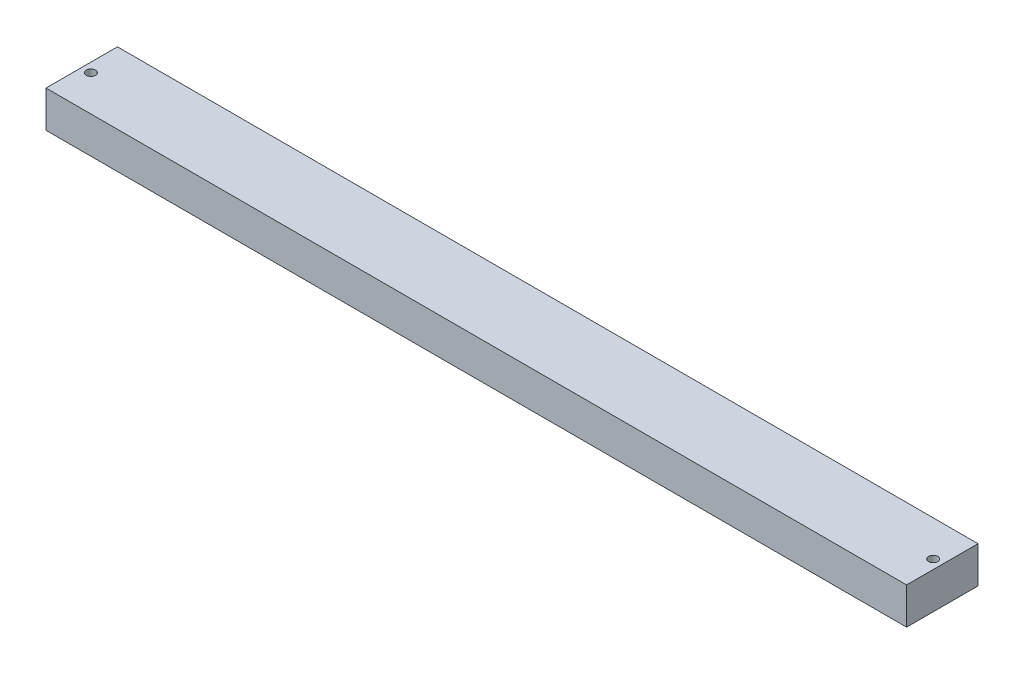
ISO-10303-21;
HEADER;
FILE_DESCRIPTION(('STEP AP214'),'2;1');
FILE_NAME('part.step','',(''),(''),'','','');
FILE_SCHEMA(('AUTOMOTIVE_DESIGN { 1 0 10303 214 1 1 1 1 }'));
ENDSEC;
DATA;
#1=APPLICATION_CONTEXT('core data for automotive mechanical design processes');
#2=APPLICATION_PROTOCOL_DEFINITION('international standard','automotive_design',2000,#1);
#3=PRODUCT_CONTEXT('',#1,'mechanical');
#4=PRODUCT('Part','Part','',(#3));
#5=PRODUCT_RELATED_PRODUCT_CATEGORY('part','',(#4));
#6=PRODUCT_DEFINITION_FORMATION('','',#4);
#7=PRODUCT_DEFINITION_CONTEXT('part definition',#1,'design');
#8=PRODUCT_DEFINITION('design','',#6,#7);
#9=PRODUCT_DEFINITION_SHAPE('','',#8);
#10=(LENGTH_UNIT() NAMED_UNIT(*) SI_UNIT(.MILLI.,.METRE.));
#11=(NAMED_UNIT(*) PLANE_ANGLE_UNIT() SI_UNIT($,.RADIAN.));
#12=(NAMED_UNIT(*) SI_UNIT($,.STERADIAN.) SOLID_ANGLE_UNIT());
#13=UNCERTAINTY_MEASURE_WITH_UNIT(LENGTH_MEASURE(1.E-05),#10,'distance_accuracy_value','');
#14=(GEOMETRIC_REPRESENTATION_CONTEXT(3) GLOBAL_UNCERTAINTY_ASSIGNED_CONTEXT((#13)) GLOBAL_UNIT_ASSIGNED_CONTEXT((#10,
#11,#12)) REPRESENTATION_CONTEXT('',''));
#15=CARTESIAN_POINT('',(0.,0.,0.));
#16=DIRECTION('',(0.,0.,1.));
#17=DIRECTION('',(1.,0.,0.));
#18=AXIS2_PLACEMENT_3D('',#15,#16,#17);
#19=CARTESIAN_POINT('',(175.,-18.,0.));
#20=DIRECTION('',(0.,1.,0.));
#21=DIRECTION('',(-1.,0.,0.));
#22=AXIS2_PLACEMENT_3D('',#19,#20,#21);
#23=CYLINDRICAL_SURFACE('',#22,10.);
#24=CARTESIAN_POINT('',(175.,-9.99999999999998,0.));
#25=DIRECTION('',(0.,1.,0.));
#26=DIRECTION('',(-1.,0.,0.));
#27=AXIS2_PLACEMENT_3D('',#24,#25,#26);
#28=CIRCLE('',#27,10.);
#29=CARTESIAN_POINT('',(165.,-9.99999999999998,0.));
#30=VERTEX_POINT('',#29);
#31=EDGE_CURVE('E141',#30,#30,#28,.T.);
#32=ORIENTED_EDGE('',*,*,#31,.F.);
#33=EDGE_LOOP('',(#32));
#34=FACE_BOUND('',#33,.T.);
#35=CARTESIAN_POINT('',(175.,5.20000000000002,0.));
#36=DIRECTION('',(0.,1.,0.));
#37=DIRECTION('',(-1.,0.,0.));
#38=AXIS2_PLACEMENT_3D('',#35,#36,#37);
#39=CIRCLE('',#38,10.);
#40=CARTESIAN_POINT('',(165.,5.20000000000002,0.));
#41=VERTEX_POINT('',#40);
#42=EDGE_CURVE('E13',#41,#41,#39,.F.);
#43=ORIENTED_EDGE('',*,*,#42,.F.);
#44=EDGE_LOOP('',(#43));
#45=FACE_BOUND('',#44,.T.);
#46=ADVANCED_FACE('F48',(#34,#45),#23,.F.);
#47=CARTESIAN_POINT('',(125.,-18.,0.));
#48=DIRECTION('',(0.,1.,0.));
#49=DIRECTION('',(-1.,0.,0.));
#50=AXIS2_PLACEMENT_3D('',#47,#48,#49);
#51=CYLINDRICAL_SURFACE('',#50,10.);
#52=CARTESIAN_POINT('',(125.,-9.99999999999999,0.));
#53=DIRECTION('',(0.,1.,0.));
#54=DIRECTION('',(-1.,0.,0.));
#55=AXIS2_PLACEMENT_3D('',#52,#53,#54);
#56=CIRCLE('',#55,10.);
#57=CARTESIAN_POINT('',(115.,-9.99999999999999,0.));
#58=VERTEX_POINT('',#57);
#59=EDGE_CURVE('E138',#58,#58,#56,.T.);
#60=ORIENTED_EDGE('',*,*,#59,.F.);
#61=EDGE_LOOP('',(#60));
#62=FACE_BOUND('',#61,.T.);
#63=CARTESIAN_POINT('',(125.,5.20000000000002,0.));
#64=DIRECTION('',(0.,1.,0.));
#65=DIRECTION('',(-1.,0.,0.));
#66=AXIS2_PLACEMENT_3D('',#63,#64,#65);
#67=CIRCLE('',#66,10.);
#68=CARTESIAN_POINT('',(115.,5.20000000000002,0.));
#69=VERTEX_POINT('',#68);
#70=EDGE_CURVE('E56',#69,#69,#67,.F.);
#71=ORIENTED_EDGE('',*,*,#70,.F.);
#72=EDGE_LOOP('',(#71));
#73=FACE_BOUND('',#72,.T.);
#74=ADVANCED_FACE('F166',(#62,#73),#51,.F.);
#75=CARTESIAN_POINT('',(75.,-18.,0.));
#76=DIRECTION('',(0.,1.,0.));
#77=DIRECTION('',(-1.,0.,0.));
#78=AXIS2_PLACEMENT_3D('',#75,#76,#77);
#79=CYLINDRICAL_SURFACE('',#78,10.);
#80=CARTESIAN_POINT('',(75.,-9.99999999999999,0.));
#81=DIRECTION('',(0.,1.,0.));
#82=DIRECTION('',(-1.,0.,0.));
#83=AXIS2_PLACEMENT_3D('',#80,#81,#82);
#84=CIRCLE('',#83,10.);
#85=CARTESIAN_POINT('',(64.9999999999999,-9.99999999999999,0.));
#86=VERTEX_POINT('',#85);
#87=EDGE_CURVE('E135',#86,#86,#84,.T.);
#88=ORIENTED_EDGE('',*,*,#87,.F.);
#89=EDGE_LOOP('',(#88));
#90=FACE_BOUND('',#89,.T.);
#91=CARTESIAN_POINT('',(75.,5.20000000000001,0.));
#92=DIRECTION('',(0.,1.,0.));
#93=DIRECTION('',(-1.,0.,0.));
#94=AXIS2_PLACEMENT_3D('',#91,#92,#93);
#95=CIRCLE('',#94,10.);
#96=CARTESIAN_POINT('',(64.9999999999999,5.20000000000001,0.));
#97=VERTEX_POINT('',#96);
#98=EDGE_CURVE('E159',#97,#97,#95,.F.);
#99=ORIENTED_EDGE('',*,*,#98,.F.);
#100=EDGE_LOOP('',(#99));
#101=FACE_BOUND('',#100,.T.);
#102=ADVANCED_FACE('F168',(#90,#101),#79,.F.);
#103=CARTESIAN_POINT('',(25.,-18.,0.));
#104=DIRECTION('',(0.,1.,0.));
#105=DIRECTION('',(-1.,0.,0.));
#106=AXIS2_PLACEMENT_3D('',#103,#104,#105);
#107=CYLINDRICAL_SURFACE('',#106,10.);
#108=CARTESIAN_POINT('',(25.,-10.,0.));
#109=DIRECTION('',(0.,1.,0.));
#110=DIRECTION('',(-1.,0.,0.));
#111=AXIS2_PLACEMENT_3D('',#108,#109,#110);
#112=CIRCLE('',#111,10.);
#113=CARTESIAN_POINT('',(15.,-10.,0.));
#114=VERTEX_POINT('',#113);
#115=EDGE_CURVE('E132',#114,#114,#112,.T.);
#116=ORIENTED_EDGE('',*,*,#115,.F.);
#117=EDGE_LOOP('',(#116));
#118=FACE_BOUND('',#117,.T.);
#119=CARTESIAN_POINT('',(25.,5.20000000000001,0.));
#120=DIRECTION('',(0.,1.,0.));
#121=DIRECTION('',(-1.,0.,0.));
#122=AXIS2_PLACEMENT_3D('',#119,#120,#121);
#123=CIRCLE('',#122,10.);
#124=CARTESIAN_POINT('',(15.,5.20000000000001,0.));
#125=VERTEX_POINT('',#124);
#126=EDGE_CURVE('E156',#125,#125,#123,.F.);
#127=ORIENTED_EDGE('',*,*,#126,.F.);
#128=EDGE_LOOP('',(#127));
#129=FACE_BOUND('',#128,.T.);
#130=ADVANCED_FACE('F174',(#118,#129),#107,.F.);
#131=CARTESIAN_POINT('',(-25.,-18.,0.));
#132=DIRECTION('',(0.,1.,0.));
#133=DIRECTION('',(-1.,0.,0.));
#134=AXIS2_PLACEMENT_3D('',#131,#132,#133);
#135=CYLINDRICAL_SURFACE('',#134,10.);
#136=CARTESIAN_POINT('',(-25.,-10.,0.));
#137=DIRECTION('',(0.,1.,0.));
#138=DIRECTION('',(-1.,0.,0.));
#139=AXIS2_PLACEMENT_3D('',#136,#137,#138);
#140=CIRCLE('',#139,10.);
#141=CARTESIAN_POINT('',(-35.,-10.,0.));
#142=VERTEX_POINT('',#141);
#143=EDGE_CURVE('E129',#142,#142,#140,.T.);
#144=ORIENTED_EDGE('',*,*,#143,.F.);
#145=EDGE_LOOP('',(#144));
#146=FACE_BOUND('',#145,.T.);
#147=CARTESIAN_POINT('',(-25.,5.2,0.));
#148=DIRECTION('',(0.,1.,0.));
#149=DIRECTION('',(-1.,0.,0.));
#150=AXIS2_PLACEMENT_3D('',#147,#148,#149);
#151=CIRCLE('',#150,10.);
#152=CARTESIAN_POINT('',(-35.,5.2,0.));
#153=VERTEX_POINT('',#152);
#154=EDGE_CURVE('E153',#153,#153,#151,.F.);
#155=ORIENTED_EDGE('',*,*,#154,.F.);
#156=EDGE_LOOP('',(#155));
#157=FACE_BOUND('',#156,.T.);
#158=ADVANCED_FACE('F182',(#146,#157),#135,.F.);
#159=CARTESIAN_POINT('',(-75.0000000000001,-18.,0.));
#160=DIRECTION('',(0.,1.,0.));
#161=DIRECTION('',(-1.,0.,0.));
#162=AXIS2_PLACEMENT_3D('',#159,#160,#161);
#163=CYLINDRICAL_SURFACE('',#162,10.);
#164=CARTESIAN_POINT('',(-75.0000000000001,-10.,0.));
#165=DIRECTION('',(0.,1.,0.));
#166=DIRECTION('',(-1.,0.,0.));
#167=AXIS2_PLACEMENT_3D('',#164,#165,#166);
#168=CIRCLE('',#167,10.);
#169=CARTESIAN_POINT('',(-85.0000000000001,-10.,0.));
#170=VERTEX_POINT('',#169);
#171=EDGE_CURVE('E126',#170,#170,#168,.T.);
#172=ORIENTED_EDGE('',*,*,#171,.F.);
#173=EDGE_LOOP('',(#172));
#174=FACE_BOUND('',#173,.T.);
#175=CARTESIAN_POINT('',(-75.0000000000001,5.19999999999999,0.));
#176=DIRECTION('',(0.,1.,0.));
#177=DIRECTION('',(-1.,0.,0.));
#178=AXIS2_PLACEMENT_3D('',#175,#176,#177);
#179=CIRCLE('',#178,10.);
#180=CARTESIAN_POINT('',(-85.0000000000001,5.19999999999999,0.));
#181=VERTEX_POINT('',#180);
#182=EDGE_CURVE('E150',#181,#181,#179,.F.);
#183=ORIENTED_EDGE('',*,*,#182,.F.);
#184=EDGE_LOOP('',(#183));
#185=FACE_BOUND('',#184,.T.);
#186=ADVANCED_FACE('F186',(#174,#185),#163,.F.);
#187=CARTESIAN_POINT('',(-125.,-18.,0.));
#188=DIRECTION('',(0.,1.,0.));
#189=DIRECTION('',(-1.,0.,0.));
#190=AXIS2_PLACEMENT_3D('',#187,#188,#189);
#191=CYLINDRICAL_SURFACE('',#190,10.);
#192=CARTESIAN_POINT('',(-125.,-10.,0.));
#193=DIRECTION('',(0.,1.,0.));
#194=DIRECTION('',(-1.,0.,0.));
#195=AXIS2_PLACEMENT_3D('',#192,#193,#194);
#196=CIRCLE('',#195,10.);
#197=CARTESIAN_POINT('',(-135.,-10.,0.));
#198=VERTEX_POINT('',#197);
#199=EDGE_CURVE('E327',#198,#198,#196,.T.);
#200=ORIENTED_EDGE('',*,*,#199,.F.);
#201=EDGE_LOOP('',(#200));
#202=FACE_BOUND('',#201,.T.);
#203=CARTESIAN_POINT('',(-125.,5.19999999999999,0.));
#204=DIRECTION('',(0.,1.,0.));
#205=DIRECTION('',(-1.,0.,0.));
#206=AXIS2_PLACEMENT_3D('',#203,#204,#205);
#207=CIRCLE('',#206,10.);
#208=CARTESIAN_POINT('',(-135.,5.19999999999999,0.));
#209=VERTEX_POINT('',#208);
#210=EDGE_CURVE('E147',#209,#209,#207,.F.);
#211=ORIENTED_EDGE('',*,*,#210,.F.);
#212=EDGE_LOOP('',(#211));
#213=FACE_BOUND('',#212,.T.);
#214=ADVANCED_FACE('F190',(#202,#213),#191,.F.);
#215=CARTESIAN_POINT('',(-175.,-18.,0.));
#216=DIRECTION('',(0.,1.,0.));
#217=DIRECTION('',(-1.,0.,0.));
#218=AXIS2_PLACEMENT_3D('',#215,#216,#217);
#219=CYLINDRICAL_SURFACE('',#218,10.);
#220=CARTESIAN_POINT('',(-175.,-10.,0.));
#221=DIRECTION('',(0.,1.,0.));
#222=DIRECTION('',(-1.,0.,0.));
#223=AXIS2_PLACEMENT_3D('',#220,#221,#222);
#224=CIRCLE('',#223,10.);
#225=CARTESIAN_POINT('',(-185.,-10.,0.));
#226=VERTEX_POINT('',#225);
#227=EDGE_CURVE('E119',#226,#226,#224,.T.);
#228=ORIENTED_EDGE('',*,*,#227,.F.);
#229=EDGE_LOOP('',(#228));
#230=FACE_BOUND('',#229,.T.);
#231=CARTESIAN_POINT('',(-175.,5.19999999999998,0.));
#232=DIRECTION('',(0.,1.,0.));
#233=DIRECTION('',(-1.,0.,0.));
#234=AXIS2_PLACEMENT_3D('',#231,#232,#233);
#235=CIRCLE('',#234,10.);
#236=CARTESIAN_POINT('',(-185.,5.19999999999998,0.));
#237=VERTEX_POINT('',#236);
#238=EDGE_CURVE('E144',#237,#237,#235,.F.);
#239=ORIENTED_EDGE('',*,*,#238,.F.);
#240=EDGE_LOOP('',(#239));
#241=FACE_BOUND('',#240,.T.);
#242=ADVANCED_FACE('F195',(#230,#241),#219,.F.);
#243=CARTESIAN_POINT('',(-235.,-10.,19.5));
#244=DIRECTION('',(1.,0.,0.));
#245=DIRECTION('',(0.,0.,-1.));
#246=AXIS2_PLACEMENT_3D('',#243,#244,#245);
#247=PLANE('',#246);
#248=CARTESIAN_POINT('',(-235.,-5.99999999993247,-12.5));
#249=DIRECTION('',(-1.,0.,0.));
#250=DIRECTION('',(0.,0.,1.));
#251=AXIS2_PLACEMENT_3D('',#248,#249,#250);
#252=CIRCLE('',#251,1.5);
#253=CARTESIAN_POINT('',(-235.,-5.99999999993247,-11.));
#254=VERTEX_POINT('',#253);
#255=EDGE_CURVE('E305',#254,#254,#252,.T.);
#256=ORIENTED_EDGE('',*,*,#255,.F.);
#257=EDGE_LOOP('',(#256));
#258=FACE_BOUND('',#257,.T.);
#259=CARTESIAN_POINT('',(-235.,6.00000000006753,9.5));
#260=DIRECTION('',(-1.,0.,0.));
#261=DIRECTION('',(0.,0.,1.));
#262=AXIS2_PLACEMENT_3D('',#259,#260,#261);
#263=CIRCLE('',#262,1.5);
#264=CARTESIAN_POINT('',(-235.,6.00000000006753,11.));
#265=VERTEX_POINT('',#264);
#266=EDGE_CURVE('E292',#265,#265,#263,.T.);
#267=ORIENTED_EDGE('',*,*,#266,.F.);
#268=EDGE_LOOP('',(#267));
#269=FACE_BOUND('',#268,.T.);
#270=CARTESIAN_POINT('',(-235.,-5.99999999993247,9.5));
#271=DIRECTION('',(-1.,0.,0.));
#272=DIRECTION('',(0.,0.,1.));
#273=AXIS2_PLACEMENT_3D('',#270,#271,#272);
#274=CIRCLE('',#273,1.5);
#275=CARTESIAN_POINT('',(-235.,-5.99999999993247,11.));
#276=VERTEX_POINT('',#275);
#277=EDGE_CURVE('E293',#276,#276,#274,.T.);
#278=ORIENTED_EDGE('',*,*,#277,.F.);
#279=EDGE_LOOP('',(#278));
#280=FACE_BOUND('',#279,.T.);
#281=CARTESIAN_POINT('',(-235.,6.00000000006753,-12.5));
#282=DIRECTION('',(-1.,0.,0.));
#283=DIRECTION('',(0.,0.,1.));
#284=AXIS2_PLACEMENT_3D('',#281,#282,#283);
#285=CIRCLE('',#284,1.5);
#286=CARTESIAN_POINT('',(-235.,6.00000000006753,-11.));
#287=VERTEX_POINT('',#286);
#288=EDGE_CURVE('E304',#287,#287,#285,.T.);
#289=ORIENTED_EDGE('',*,*,#288,.F.);
#290=EDGE_LOOP('',(#289));
#291=FACE_BOUND('',#290,.T.);
#292=DIRECTION('',(0.,-1.,0.));
#293=VECTOR('',#292,1.);
#294=CARTESIAN_POINT('',(-235.,-10.,-19.5));
#295=LINE('',#294,#293);
#296=CARTESIAN_POINT('',(-235.,9.99999999999997,-19.5));
#297=VERTEX_POINT('',#296);
#298=CARTESIAN_POINT('',(-235.,-10.,-19.5));
#299=VERTEX_POINT('',#298);
#300=EDGE_CURVE('E116',#297,#299,#295,.T.);
#301=ORIENTED_EDGE('',*,*,#300,.T.);
#302=DIRECTION('',(0.,0.,-1.));
#303=VECTOR('',#302,1.);
#304=CARTESIAN_POINT('',(-235.,-10.,19.5));
#305=LINE('',#304,#303);
#306=CARTESIAN_POINT('',(-235.,-10.,19.5));
#307=VERTEX_POINT('',#306);
#308=EDGE_CURVE('E107',#307,#299,#305,.T.);
#309=ORIENTED_EDGE('',*,*,#308,.F.);
#310=DIRECTION('',(0.,-1.,0.));
#311=VECTOR('',#310,1.);
#312=CARTESIAN_POINT('',(-235.,-10.,19.5));
#313=LINE('',#312,#311);
#314=CARTESIAN_POINT('',(-235.,9.99999999999997,19.5));
#315=VERTEX_POINT('',#314);
#316=EDGE_CURVE('E100',#315,#307,#313,.T.);
#317=ORIENTED_EDGE('',*,*,#316,.F.);
#318=DIRECTION('',(0.,0.,-1.));
#319=VECTOR('',#318,1.);
#320=CARTESIAN_POINT('',(-235.,9.99999999999997,19.5));
#321=LINE('',#320,#319);
#322=EDGE_CURVE('E112',#315,#297,#321,.T.);
#323=ORIENTED_EDGE('',*,*,#322,.T.);
#324=EDGE_LOOP('',(#301,#309,#317,#323));
#325=FACE_BOUND('',#324,.T.);
#326=ADVANCED_FACE('F192',(#258,#269,#280,#291,#325),#247,.F.);
#327=CARTESIAN_POINT('',(235.,-9.99999999999997,19.5));
#328=DIRECTION('',(0.,1.,0.));
#329=DIRECTION('',(-1.,0.,0.));
#330=AXIS2_PLACEMENT_3D('',#327,#328,#329);
#331=PLANE('',#330);
#332=CARTESIAN_POINT('',(-230.,-10.,0.));
#333=DIRECTION('',(0.,1.,0.));
#334=DIRECTION('',(-1.,0.,0.));
#335=AXIS2_PLACEMENT_3D('',#332,#333,#334);
#336=CIRCLE('',#335,2.5);
#337=CARTESIAN_POINT('',(-232.5,-10.,0.));
#338=VERTEX_POINT('',#337);
#339=EDGE_CURVE('E318',#338,#338,#336,.F.);
#340=ORIENTED_EDGE('',*,*,#339,.F.);
#341=EDGE_LOOP('',(#340));
#342=FACE_BOUND('',#341,.T.);
#343=CARTESIAN_POINT('',(230.,-9.99999999999997,0.));
#344=DIRECTION('',(0.,1.,0.));
#345=DIRECTION('',(-1.,0.,0.));
#346=AXIS2_PLACEMENT_3D('',#343,#344,#345);
#347=CIRCLE('',#346,2.5);
#348=CARTESIAN_POINT('',(227.5,-9.99999999999997,0.));
#349=VERTEX_POINT('',#348);
#350=EDGE_CURVE('E324',#349,#349,#347,.T.);
#351=ORIENTED_EDGE('',*,*,#350,.T.);
#352=EDGE_LOOP('',(#351));
#353=FACE_BOUND('',#352,.T.);
#354=ORIENTED_EDGE('',*,*,#199,.T.);
#355=EDGE_LOOP('',(#354));
#356=FACE_BOUND('',#355,.T.);
#357=ORIENTED_EDGE('',*,*,#227,.T.);
#358=EDGE_LOOP('',(#357));
#359=FACE_BOUND('',#358,.T.);
#360=DIRECTION('',(1.,0.,0.));
#361=VECTOR('',#360,1.);
#362=CARTESIAN_POINT('',(235.,-9.99999999999997,-19.5));
#363=LINE('',#362,#361);
#364=CARTESIAN_POINT('',(235.,-9.99999999999997,-19.5));
#365=VERTEX_POINT('',#364);
#366=EDGE_CURVE('E106',#299,#365,#363,.T.);
#367=ORIENTED_EDGE('',*,*,#366,.T.);
#368=DIRECTION('',(0.,0.,-1.));
#369=VECTOR('',#368,1.);
#370=CARTESIAN_POINT('',(235.,-9.99999999999997,19.5));
#371=LINE('',#370,#369);
#372=CARTESIAN_POINT('',(235.,-9.99999999999997,19.5));
#373=VERTEX_POINT('',#372);
#374=EDGE_CURVE('E103',#373,#365,#371,.T.);
#375=ORIENTED_EDGE('',*,*,#374,.F.);
#376=DIRECTION('',(1.,0.,0.));
#377=VECTOR('',#376,1.);
#378=CARTESIAN_POINT('',(235.,-9.99999999999997,19.5));
#379=LINE('',#378,#377);
#380=EDGE_CURVE('E95',#307,#373,#379,.T.);
#381=ORIENTED_EDGE('',*,*,#380,.F.);
#382=ORIENTED_EDGE('',*,*,#308,.T.);
#383=EDGE_LOOP('',(#367,#375,#381,#382));
#384=FACE_BOUND('',#383,.T.);
#385=ORIENTED_EDGE('',*,*,#171,.T.);
#386=EDGE_LOOP('',(#385));
#387=FACE_BOUND('',#386,.T.);
#388=ORIENTED_EDGE('',*,*,#143,.T.);
#389=EDGE_LOOP('',(#388));
#390=FACE_BOUND('',#389,.T.);
#391=ORIENTED_EDGE('',*,*,#115,.T.);
#392=EDGE_LOOP('',(#391));
#393=FACE_BOUND('',#392,.T.);
#394=ORIENTED_EDGE('',*,*,#87,.T.);
#395=EDGE_LOOP('',(#394));
#396=FACE_BOUND('',#395,.T.);
#397=ORIENTED_EDGE('',*,*,#59,.T.);
#398=EDGE_LOOP('',(#397));
#399=FACE_BOUND('',#398,.T.);
#400=ORIENTED_EDGE('',*,*,#31,.T.);
#401=EDGE_LOOP('',(#400));
#402=FACE_BOUND('',#401,.T.);
#403=ADVANCED_FACE('F104',(#342,#353,#356,#359,#384,#387,#390,#393,#396,#399,#402),#331,.F.);
#404=CARTESIAN_POINT('',(235.,-9.99999999999997,19.5));
#405=DIRECTION('',(-1.,0.,0.));
#406=DIRECTION('',(0.,0.,1.));
#407=AXIS2_PLACEMENT_3D('',#404,#405,#406);
#408=PLANE('',#407);
#409=DIRECTION('',(0.,1.,0.));
#410=VECTOR('',#409,1.);
#411=CARTESIAN_POINT('',(235.,-9.99999999999997,-19.5));
#412=LINE('',#411,#410);
#413=CARTESIAN_POINT('',(235.,10.,-19.5));
#414=VERTEX_POINT('',#413);
#415=EDGE_CURVE('E81',#365,#414,#412,.T.);
#416=ORIENTED_EDGE('',*,*,#415,.T.);
#417=DIRECTION('',(0.,0.,-1.));
#418=VECTOR('',#417,1.);
#419=CARTESIAN_POINT('',(235.,10.,19.5));
#420=LINE('',#419,#418);
#421=CARTESIAN_POINT('',(235.,10.,19.5));
#422=VERTEX_POINT('',#421);
#423=EDGE_CURVE('E108',#422,#414,#420,.T.);
#424=ORIENTED_EDGE('',*,*,#423,.F.);
#425=DIRECTION('',(0.,1.,0.));
#426=VECTOR('',#425,1.);
#427=CARTESIAN_POINT('',(235.,-9.99999999999997,19.5));
#428=LINE('',#427,#426);
#429=EDGE_CURVE('E98',#373,#422,#428,.T.);
#430=ORIENTED_EDGE('',*,*,#429,.F.);
#431=ORIENTED_EDGE('',*,*,#374,.T.);
#432=EDGE_LOOP('',(#416,#424,#430,#431));
#433=FACE_BOUND('',#432,.T.);
#434=ADVANCED_FACE('F110',(#433),#408,.F.);
#435=CARTESIAN_POINT('',(235.,10.,19.5));
#436=DIRECTION('',(0.,-1.,0.));
#437=DIRECTION('',(1.,0.,0.));
#438=AXIS2_PLACEMENT_3D('',#435,#436,#437);
#439=PLANE('',#438);
#440=CARTESIAN_POINT('',(-230.,10.,0.));
#441=DIRECTION('',(0.,-1.,0.));
#442=DIRECTION('',(1.,0.,0.));
#443=AXIS2_PLACEMENT_3D('',#440,#441,#442);
#444=CIRCLE('',#443,2.5);
#445=CARTESIAN_POINT('',(-227.5,10.,0.));
#446=VERTEX_POINT('',#445);
#447=EDGE_CURVE('E313',#446,#446,#444,.T.);
#448=ORIENTED_EDGE('',*,*,#447,.T.);
#449=EDGE_LOOP('',(#448));
#450=FACE_BOUND('',#449,.T.);
#451=CARTESIAN_POINT('',(230.,10.,0.));
#452=DIRECTION('',(0.,1.,0.));
#453=DIRECTION('',(-1.,0.,0.));
#454=AXIS2_PLACEMENT_3D('',#451,#452,#453);
#455=CIRCLE('',#454,2.5);
#456=CARTESIAN_POINT('',(227.5,10.,0.));
#457=VERTEX_POINT('',#456);
#458=EDGE_CURVE('E321',#457,#457,#455,.T.);
#459=ORIENTED_EDGE('',*,*,#458,.F.);
#460=EDGE_LOOP('',(#459));
#461=FACE_BOUND('',#460,.T.);
#462=DIRECTION('',(-1.,0.,0.));
#463=VECTOR('',#462,1.);
#464=CARTESIAN_POINT('',(235.,10.,-19.5));
#465=LINE('',#464,#463);
#466=EDGE_CURVE('E87',#414,#297,#465,.T.);
#467=ORIENTED_EDGE('',*,*,#466,.T.);
#468=ORIENTED_EDGE('',*,*,#322,.F.);
#469=DIRECTION('',(-1.,0.,0.));
#470=VECTOR('',#469,1.);
#471=CARTESIAN_POINT('',(235.,10.,19.5));
#472=LINE('',#471,#470);
#473=EDGE_CURVE('E64',#422,#315,#472,.T.);
#474=ORIENTED_EDGE('',*,*,#473,.F.);
#475=ORIENTED_EDGE('',*,*,#423,.T.);
#476=EDGE_LOOP('',(#467,#468,#474,#475));
#477=FACE_BOUND('',#476,.T.);
#478=ADVANCED_FACE('F202',(#450,#461,#477),#439,.F.);
#479=CARTESIAN_POINT('',(0.,0.,19.5));
#480=DIRECTION('',(0.,0.,1.));
#481=DIRECTION('',(1.,0.,0.));
#482=AXIS2_PLACEMENT_3D('',#479,#480,#481);
#483=PLANE('',#482);
#484=ORIENTED_EDGE('',*,*,#316,.T.);
#485=ORIENTED_EDGE('',*,*,#380,.T.);
#486=ORIENTED_EDGE('',*,*,#429,.T.);
#487=ORIENTED_EDGE('',*,*,#473,.T.);
#488=EDGE_LOOP('',(#484,#485,#486,#487));
#489=FACE_BOUND('',#488,.T.);
#490=ADVANCED_FACE('F96',(#489),#483,.T.);
#491=CARTESIAN_POINT('',(0.,0.,-19.5));
#492=DIRECTION('',(0.,0.,1.));
#493=DIRECTION('',(1.,0.,0.));
#494=AXIS2_PLACEMENT_3D('',#491,#492,#493);
#495=PLANE('',#494);
#496=ORIENTED_EDGE('',*,*,#300,.F.);
#497=ORIENTED_EDGE('',*,*,#466,.F.);
#498=ORIENTED_EDGE('',*,*,#415,.F.);
#499=ORIENTED_EDGE('',*,*,#366,.F.);
#500=EDGE_LOOP('',(#496,#497,#498,#499));
#501=FACE_BOUND('',#500,.T.);
#502=ADVANCED_FACE('F206',(#501),#495,.F.);
#503=CARTESIAN_POINT('',(230.,-32.,0.));
#504=DIRECTION('',(0.,1.,0.));
#505=DIRECTION('',(-1.,0.,0.));
#506=AXIS2_PLACEMENT_3D('',#503,#504,#505);
#507=CYLINDRICAL_SURFACE('',#506,2.5);
#508=ORIENTED_EDGE('',*,*,#458,.T.);
#509=EDGE_LOOP('',(#508));
#510=FACE_BOUND('',#509,.T.);
#511=ORIENTED_EDGE('',*,*,#350,.F.);
#512=EDGE_LOOP('',(#511));
#513=FACE_BOUND('',#512,.T.);
#514=ADVANCED_FACE('F209',(#510,#513),#507,.F.);
#515=CARTESIAN_POINT('',(-230.,-32.,0.));
#516=DIRECTION('',(0.,1.,0.));
#517=DIRECTION('',(-1.,0.,0.));
#518=AXIS2_PLACEMENT_3D('',#515,#516,#517);
#519=CYLINDRICAL_SURFACE('',#518,2.5);
#520=ORIENTED_EDGE('',*,*,#447,.F.);
#521=EDGE_LOOP('',(#520));
#522=FACE_BOUND('',#521,.T.);
#523=ORIENTED_EDGE('',*,*,#339,.T.);
#524=EDGE_LOOP('',(#523));
#525=FACE_BOUND('',#524,.T.);
#526=ADVANCED_FACE('F221',(#522,#525),#519,.F.);
#527=CARTESIAN_POINT('',(-175.,5.19999999999998,0.));
#528=DIRECTION('',(0.,1.,0.));
#529=DIRECTION('',(-1.,0.,0.));
#530=AXIS2_PLACEMENT_3D('',#527,#528,#529);
#531=PLANE('',#530);
#532=ORIENTED_EDGE('',*,*,#238,.T.);
#533=EDGE_LOOP('',(#532));
#534=FACE_BOUND('',#533,.T.);
#535=ADVANCED_FACE('F225',(#534),#531,.F.);
#536=CARTESIAN_POINT('',(-125.,5.19999999999999,0.));
#537=DIRECTION('',(0.,1.,0.));
#538=DIRECTION('',(-1.,0.,0.));
#539=AXIS2_PLACEMENT_3D('',#536,#537,#538);
#540=PLANE('',#539);
#541=ORIENTED_EDGE('',*,*,#210,.T.);
#542=EDGE_LOOP('',(#541));
#543=FACE_BOUND('',#542,.T.);
#544=ADVANCED_FACE('F229',(#543),#540,.F.);
#545=CARTESIAN_POINT('',(-75.0000000000001,5.19999999999999,0.));
#546=DIRECTION('',(0.,1.,0.));
#547=DIRECTION('',(-1.,0.,0.));
#548=AXIS2_PLACEMENT_3D('',#545,#546,#547);
#549=PLANE('',#548);
#550=ORIENTED_EDGE('',*,*,#182,.T.);
#551=EDGE_LOOP('',(#550));
#552=FACE_BOUND('',#551,.T.);
#553=ADVANCED_FACE('F233',(#552),#549,.F.);
#554=CARTESIAN_POINT('',(-25.,5.2,0.));
#555=DIRECTION('',(0.,1.,0.));
#556=DIRECTION('',(-1.,0.,0.));
#557=AXIS2_PLACEMENT_3D('',#554,#555,#556);
#558=PLANE('',#557);
#559=ORIENTED_EDGE('',*,*,#154,.T.);
#560=EDGE_LOOP('',(#559));
#561=FACE_BOUND('',#560,.T.);
#562=ADVANCED_FACE('F237',(#561),#558,.F.);
#563=CARTESIAN_POINT('',(25.,5.20000000000001,0.));
#564=DIRECTION('',(0.,1.,0.));
#565=DIRECTION('',(-1.,0.,0.));
#566=AXIS2_PLACEMENT_3D('',#563,#564,#565);
#567=PLANE('',#566);
#568=ORIENTED_EDGE('',*,*,#126,.T.);
#569=EDGE_LOOP('',(#568));
#570=FACE_BOUND('',#569,.T.);
#571=ADVANCED_FACE('F241',(#570),#567,.F.);
#572=CARTESIAN_POINT('',(75.,5.20000000000001,0.));
#573=DIRECTION('',(0.,1.,0.));
#574=DIRECTION('',(-1.,0.,0.));
#575=AXIS2_PLACEMENT_3D('',#572,#573,#574);
#576=PLANE('',#575);
#577=ORIENTED_EDGE('',*,*,#98,.T.);
#578=EDGE_LOOP('',(#577));
#579=FACE_BOUND('',#578,.T.);
#580=ADVANCED_FACE('F245',(#579),#576,.F.);
#581=CARTESIAN_POINT('',(125.,5.20000000000002,0.));
#582=DIRECTION('',(0.,1.,0.));
#583=DIRECTION('',(-1.,0.,0.));
#584=AXIS2_PLACEMENT_3D('',#581,#582,#583);
#585=PLANE('',#584);
#586=ORIENTED_EDGE('',*,*,#70,.T.);
#587=EDGE_LOOP('',(#586));
#588=FACE_BOUND('',#587,.T.);
#589=ADVANCED_FACE('F164',(#588),#585,.F.);
#590=CARTESIAN_POINT('',(175.,5.20000000000002,0.));
#591=DIRECTION('',(0.,1.,0.));
#592=DIRECTION('',(-1.,0.,0.));
#593=AXIS2_PLACEMENT_3D('',#590,#591,#592);
#594=PLANE('',#593);
#595=ORIENTED_EDGE('',*,*,#42,.T.);
#596=EDGE_LOOP('',(#595));
#597=FACE_BOUND('',#596,.T.);
#598=ADVANCED_FACE('F252',(#597),#594,.F.);
#599=CARTESIAN_POINT('',(-225.,6.00000000006753,-12.5));
#600=DIRECTION('',(-1.,0.,0.));
#601=DIRECTION('',(0.,0.,1.));
#602=AXIS2_PLACEMENT_3D('',#599,#600,#601);
#603=CYLINDRICAL_SURFACE('',#602,1.5);
#604=CARTESIAN_POINT('',(-225.,6.00000000006753,-12.5));
#605=DIRECTION('',(-1.,0.,0.));
#606=DIRECTION('',(0.,0.,1.));
#607=AXIS2_PLACEMENT_3D('',#604,#605,#606);
#608=CIRCLE('',#607,1.5);
#609=CARTESIAN_POINT('',(-225.,6.00000000006753,-11.));
#610=VERTEX_POINT('',#609);
#611=EDGE_CURVE('E310',#610,#610,#608,.T.);
#612=ORIENTED_EDGE('',*,*,#611,.F.);
#613=EDGE_LOOP('',(#612));
#614=FACE_BOUND('',#613,.T.);
#615=ORIENTED_EDGE('',*,*,#288,.T.);
#616=EDGE_LOOP('',(#615));
#617=FACE_BOUND('',#616,.T.);
#618=ADVANCED_FACE('F255',(#614,#617),#603,.F.);
#619=CARTESIAN_POINT('',(-225.,6.00000000006753,-12.5));
#620=DIRECTION('',(-1.,0.,0.));
#621=DIRECTION('',(0.,0.,1.));
#622=AXIS2_PLACEMENT_3D('',#619,#620,#621);
#623=PLANE('',#622);
#624=ORIENTED_EDGE('',*,*,#611,.T.);
#625=EDGE_LOOP('',(#624));
#626=FACE_BOUND('',#625,.T.);
#627=ADVANCED_FACE('F259',(#626),#623,.T.);
#628=CARTESIAN_POINT('',(-225.,-5.99999999993247,9.5));
#629=DIRECTION('',(-1.,0.,0.));
#630=DIRECTION('',(0.,0.,1.));
#631=AXIS2_PLACEMENT_3D('',#628,#629,#630);
#632=CYLINDRICAL_SURFACE('',#631,1.5);
#633=CARTESIAN_POINT('',(-225.,-5.99999999993247,9.5));
#634=DIRECTION('',(-1.,0.,0.));
#635=DIRECTION('',(0.,0.,1.));
#636=AXIS2_PLACEMENT_3D('',#633,#634,#635);
#637=CIRCLE('',#636,1.5);
#638=CARTESIAN_POINT('',(-225.,-5.99999999993247,11.));
#639=VERTEX_POINT('',#638);
#640=EDGE_CURVE('E291',#639,#639,#637,.T.);
#641=ORIENTED_EDGE('',*,*,#640,.F.);
#642=EDGE_LOOP('',(#641));
#643=FACE_BOUND('',#642,.T.);
#644=ORIENTED_EDGE('',*,*,#277,.T.);
#645=EDGE_LOOP('',(#644));
#646=FACE_BOUND('',#645,.T.);
#647=ADVANCED_FACE('F263',(#643,#646),#632,.F.);
#648=CARTESIAN_POINT('',(-225.,-5.99999999993247,9.5));
#649=DIRECTION('',(-1.,0.,0.));
#650=DIRECTION('',(0.,0.,1.));
#651=AXIS2_PLACEMENT_3D('',#648,#649,#650);
#652=PLANE('',#651);
#653=ORIENTED_EDGE('',*,*,#640,.T.);
#654=EDGE_LOOP('',(#653));
#655=FACE_BOUND('',#654,.T.);
#656=ADVANCED_FACE('F269',(#655),#652,.T.);
#657=CARTESIAN_POINT('',(-225.,6.00000000006753,9.5));
#658=DIRECTION('',(-1.,0.,0.));
#659=DIRECTION('',(0.,0.,1.));
#660=AXIS2_PLACEMENT_3D('',#657,#658,#659);
#661=CYLINDRICAL_SURFACE('',#660,1.5);
#662=CARTESIAN_POINT('',(-225.,6.00000000006753,9.5));
#663=DIRECTION('',(-1.,0.,0.));
#664=DIRECTION('',(0.,0.,1.));
#665=AXIS2_PLACEMENT_3D('',#662,#663,#664);
#666=CIRCLE('',#665,1.5);
#667=CARTESIAN_POINT('',(-225.,6.00000000006753,11.));
#668=VERTEX_POINT('',#667);
#669=EDGE_CURVE('E296',#668,#668,#666,.T.);
#670=ORIENTED_EDGE('',*,*,#669,.F.);
#671=EDGE_LOOP('',(#670));
#672=FACE_BOUND('',#671,.T.);
#673=ORIENTED_EDGE('',*,*,#266,.T.);
#674=EDGE_LOOP('',(#673));
#675=FACE_BOUND('',#674,.T.);
#676=ADVANCED_FACE('F265',(#672,#675),#661,.F.);
#677=CARTESIAN_POINT('',(-225.,6.00000000006753,9.5));
#678=DIRECTION('',(-1.,0.,0.));
#679=DIRECTION('',(0.,0.,1.));
#680=AXIS2_PLACEMENT_3D('',#677,#678,#679);
#681=PLANE('',#680);
#682=ORIENTED_EDGE('',*,*,#669,.T.);
#683=EDGE_LOOP('',(#682));
#684=FACE_BOUND('',#683,.T.);
#685=ADVANCED_FACE('F268',(#684),#681,.T.);
#686=CARTESIAN_POINT('',(-225.,-5.99999999993247,-12.5));
#687=DIRECTION('',(-1.,0.,0.));
#688=DIRECTION('',(0.,0.,1.));
#689=AXIS2_PLACEMENT_3D('',#686,#687,#688);
#690=CYLINDRICAL_SURFACE('',#689,1.5);
#691=CARTESIAN_POINT('',(-225.,-5.99999999993247,-12.5));
#692=DIRECTION('',(-1.,0.,0.));
#693=DIRECTION('',(0.,0.,1.));
#694=AXIS2_PLACEMENT_3D('',#691,#692,#693);
#695=CIRCLE('',#694,1.5);
#696=CARTESIAN_POINT('',(-225.,-5.99999999993247,-11.));
#697=VERTEX_POINT('',#696);
#698=EDGE_CURVE('E301',#697,#697,#695,.T.);
#699=ORIENTED_EDGE('',*,*,#698,.F.);
#700=EDGE_LOOP('',(#699));
#701=FACE_BOUND('',#700,.T.);
#702=ORIENTED_EDGE('',*,*,#255,.T.);
#703=EDGE_LOOP('',(#702));
#704=FACE_BOUND('',#703,.T.);
#705=ADVANCED_FACE('F273',(#701,#704),#690,.F.);
#706=CARTESIAN_POINT('',(-225.,-5.99999999993247,-12.5));
#707=DIRECTION('',(-1.,0.,0.));
#708=DIRECTION('',(0.,0.,1.));
#709=AXIS2_PLACEMENT_3D('',#706,#707,#708);
#710=PLANE('',#709);
#711=ORIENTED_EDGE('',*,*,#698,.T.);
#712=EDGE_LOOP('',(#711));
#713=FACE_BOUND('',#712,.T.);
#714=ADVANCED_FACE('F277',(#713),#710,.T.);
#715=CLOSED_SHELL('',(#46,#74,#102,#130,#158,#186,#214,#242,#326,#403,#434,#478,#490,#502,#514,
#526,#535,#544,#553,#562,#571,#580,#589,#598,#618,#627,#647,#656,#676,#685,#705,#714));
#716=MANIFOLD_SOLID_BREP('B2',#715);
#717=ADVANCED_BREP_SHAPE_REPRESENTATION('',(#18,#716),#14);
#718=SHAPE_DEFINITION_REPRESENTATION(#9,#717);
ENDSEC;
END-ISO-10303-21;
